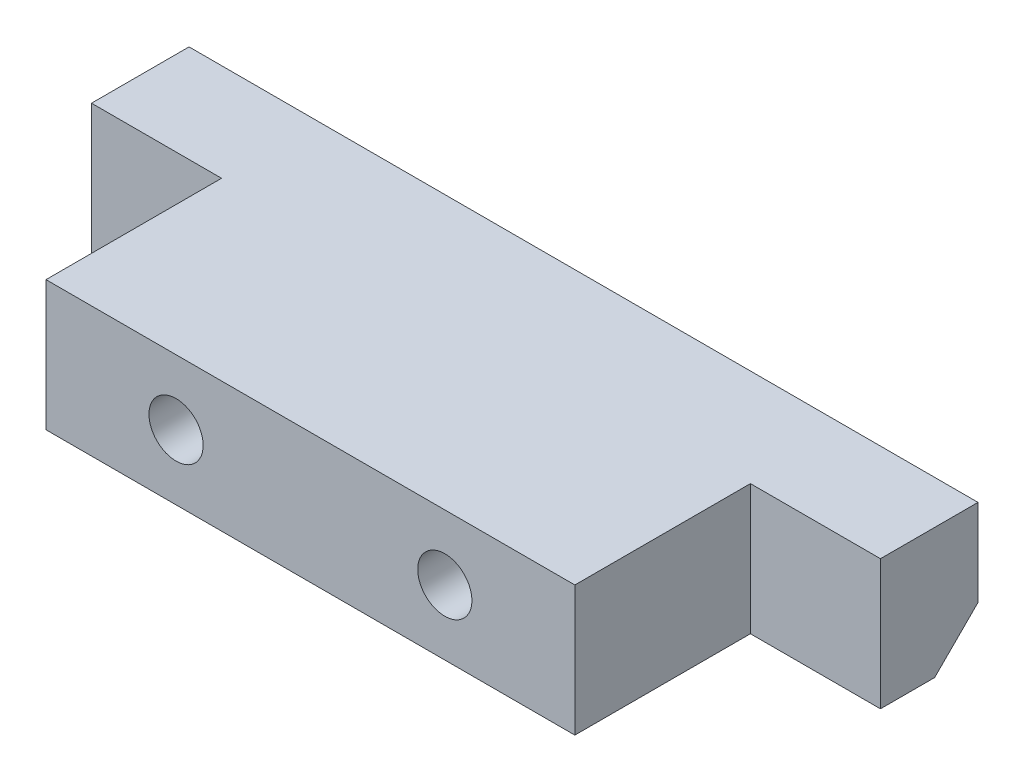
ISO-10303-21;
HEADER;
FILE_DESCRIPTION(('STEP AP214'),'2;1');
FILE_NAME('part.step','',(''),(''),'','','');
FILE_SCHEMA(('AUTOMOTIVE_DESIGN { 1 0 10303 214 1 1 1 1 }'));
ENDSEC;
DATA;
#1=APPLICATION_CONTEXT('core data for automotive mechanical design processes');
#2=APPLICATION_PROTOCOL_DEFINITION('international standard','automotive_design',2000,#1);
#3=PRODUCT_CONTEXT('',#1,'mechanical');
#4=PRODUCT('Part','Part','',(#3));
#5=PRODUCT_RELATED_PRODUCT_CATEGORY('part','',(#4));
#6=PRODUCT_DEFINITION_FORMATION('','',#4);
#7=PRODUCT_DEFINITION_CONTEXT('part definition',#1,'design');
#8=PRODUCT_DEFINITION('design','',#6,#7);
#9=PRODUCT_DEFINITION_SHAPE('','',#8);
#10=(LENGTH_UNIT() NAMED_UNIT(*) SI_UNIT(.MILLI.,.METRE.));
#11=(NAMED_UNIT(*) PLANE_ANGLE_UNIT() SI_UNIT($,.RADIAN.));
#12=(NAMED_UNIT(*) SI_UNIT($,.STERADIAN.) SOLID_ANGLE_UNIT());
#13=UNCERTAINTY_MEASURE_WITH_UNIT(LENGTH_MEASURE(1.E-05),#10,'distance_accuracy_value','');
#14=(GEOMETRIC_REPRESENTATION_CONTEXT(3) GLOBAL_UNCERTAINTY_ASSIGNED_CONTEXT((#13)) GLOBAL_UNIT_ASSIGNED_CONTEXT((#10,
#11,#12)) REPRESENTATION_CONTEXT('',''));
#15=CARTESIAN_POINT('',(0.,0.,0.));
#16=DIRECTION('',(0.,0.,1.));
#17=DIRECTION('',(1.,0.,0.));
#18=AXIS2_PLACEMENT_3D('',#15,#16,#17);
#19=CARTESIAN_POINT('',(-12.2,0.,8.1));
#20=DIRECTION('',(1.,0.,0.));
#21=DIRECTION('',(0.,0.,-1.));
#22=AXIS2_PLACEMENT_3D('',#19,#20,#21);
#23=PLANE('',#22);
#24=DIRECTION('',(0.,-1.,0.));
#25=VECTOR('',#24,1.);
#26=CARTESIAN_POINT('',(-12.2,0.,0.));
#27=LINE('',#26,#25);
#28=CARTESIAN_POINT('',(-12.2,6.,0.));
#29=VERTEX_POINT('',#28);
#30=CARTESIAN_POINT('',(-12.2,0.,0.));
#31=VERTEX_POINT('',#30);
#32=EDGE_CURVE('E163',#29,#31,#27,.T.);
#33=ORIENTED_EDGE('',*,*,#32,.T.);
#34=DIRECTION('',(0.,0.,-1.));
#35=VECTOR('',#34,1.);
#36=CARTESIAN_POINT('',(-12.2,0.,8.1));
#37=LINE('',#36,#35);
#38=CARTESIAN_POINT('',(-12.2,0.,8.1));
#39=VERTEX_POINT('',#38);
#40=EDGE_CURVE('E196',#39,#31,#37,.T.);
#41=ORIENTED_EDGE('',*,*,#40,.F.);
#42=DIRECTION('',(0.,-1.,0.));
#43=VECTOR('',#42,1.);
#44=CARTESIAN_POINT('',(-12.2,0.,8.1));
#45=LINE('',#44,#43);
#46=CARTESIAN_POINT('',(-12.2,6.,8.1));
#47=VERTEX_POINT('',#46);
#48=EDGE_CURVE('E172',#47,#39,#45,.T.);
#49=ORIENTED_EDGE('',*,*,#48,.F.);
#50=DIRECTION('',(0.,0.,-1.));
#51=VECTOR('',#50,1.);
#52=CARTESIAN_POINT('',(-12.2,6.,8.1));
#53=LINE('',#52,#51);
#54=EDGE_CURVE('E179',#47,#29,#53,.T.);
#55=ORIENTED_EDGE('',*,*,#54,.T.);
#56=EDGE_LOOP('',(#33,#41,#49,#55));
#57=FACE_BOUND('',#56,.T.);
#58=ADVANCED_FACE('F32',(#57),#23,.F.);
#59=CARTESIAN_POINT('',(-12.2,0.,8.1));
#60=DIRECTION('',(0.,1.,0.));
#61=DIRECTION('',(-1.,0.,0.));
#62=AXIS2_PLACEMENT_3D('',#59,#60,#61);
#63=PLANE('',#62);
#64=DIRECTION('',(0.,0.,1.));
#65=VECTOR('',#64,1.);
#66=CARTESIAN_POINT('',(-18.2,0.,-4.5));
#67=LINE('',#66,#65);
#68=CARTESIAN_POINT('',(-18.2,0.,-2.49999999999999));
#69=VERTEX_POINT('',#68);
#70=CARTESIAN_POINT('',(-18.2,0.,0.));
#71=VERTEX_POINT('',#70);
#72=EDGE_CURVE('E161',#69,#71,#67,.T.);
#73=ORIENTED_EDGE('',*,*,#72,.F.);
#74=DIRECTION('',(1.,0.,0.));
#75=VECTOR('',#74,1.);
#76=CARTESIAN_POINT('',(-12.2,0.,-2.49999999999999));
#77=LINE('',#76,#75);
#78=CARTESIAN_POINT('',(18.2,0.,-2.49999999999999));
#79=VERTEX_POINT('',#78);
#80=EDGE_CURVE('E40',#69,#79,#77,.T.);
#81=ORIENTED_EDGE('',*,*,#80,.T.);
#82=DIRECTION('',(0.,0.,1.));
#83=VECTOR('',#82,1.);
#84=CARTESIAN_POINT('',(18.2,0.,-4.5));
#85=LINE('',#84,#83);
#86=CARTESIAN_POINT('',(18.2,0.,0.));
#87=VERTEX_POINT('',#86);
#88=EDGE_CURVE('E162',#79,#87,#85,.T.);
#89=ORIENTED_EDGE('',*,*,#88,.T.);
#90=DIRECTION('',(-1.,0.,0.));
#91=VECTOR('',#90,1.);
#92=CARTESIAN_POINT('',(18.2,0.,0.));
#93=LINE('',#92,#91);
#94=CARTESIAN_POINT('',(12.2,0.,0.));
#95=VERTEX_POINT('',#94);
#96=EDGE_CURVE('E147',#87,#95,#93,.T.);
#97=ORIENTED_EDGE('',*,*,#96,.T.);
#98=DIRECTION('',(0.,0.,-1.));
#99=VECTOR('',#98,1.);
#100=CARTESIAN_POINT('',(12.2,0.,8.1));
#101=LINE('',#100,#99);
#102=CARTESIAN_POINT('',(12.2,0.,8.1));
#103=VERTEX_POINT('',#102);
#104=EDGE_CURVE('E191',#103,#95,#101,.T.);
#105=ORIENTED_EDGE('',*,*,#104,.F.);
#106=DIRECTION('',(1.,0.,0.));
#107=VECTOR('',#106,1.);
#108=CARTESIAN_POINT('',(-12.2,0.,8.1));
#109=LINE('',#108,#107);
#110=EDGE_CURVE('E271',#39,#103,#109,.T.);
#111=ORIENTED_EDGE('',*,*,#110,.F.);
#112=ORIENTED_EDGE('',*,*,#40,.T.);
#113=EDGE_CURVE('E138',#31,#71,#93,.T.);
#114=ORIENTED_EDGE('',*,*,#113,.T.);
#115=EDGE_LOOP('',(#73,#81,#89,#97,#105,#111,#112,#114));
#116=FACE_BOUND('',#115,.T.);
#117=ADVANCED_FACE('F233',(#116),#63,.F.);
#118=CARTESIAN_POINT('',(12.2,0.,8.1));
#119=DIRECTION('',(-1.,0.,0.));
#120=DIRECTION('',(0.,-1.,0.));
#121=AXIS2_PLACEMENT_3D('',#118,#119,#120);
#122=PLANE('',#121);
#123=DIRECTION('',(0.,1.,0.));
#124=VECTOR('',#123,1.);
#125=CARTESIAN_POINT('',(12.2,0.,0.));
#126=LINE('',#125,#124);
#127=CARTESIAN_POINT('',(12.2,6.,0.));
#128=VERTEX_POINT('',#127);
#129=EDGE_CURVE('E166',#95,#128,#126,.T.);
#130=ORIENTED_EDGE('',*,*,#129,.T.);
#131=DIRECTION('',(0.,0.,-1.));
#132=VECTOR('',#131,1.);
#133=CARTESIAN_POINT('',(12.2,6.,8.1));
#134=LINE('',#133,#132);
#135=CARTESIAN_POINT('',(12.2,6.,8.1));
#136=VERTEX_POINT('',#135);
#137=EDGE_CURVE('E188',#136,#128,#134,.T.);
#138=ORIENTED_EDGE('',*,*,#137,.F.);
#139=DIRECTION('',(0.,1.,0.));
#140=VECTOR('',#139,1.);
#141=CARTESIAN_POINT('',(12.2,0.,8.1));
#142=LINE('',#141,#140);
#143=EDGE_CURVE('E275',#103,#136,#142,.T.);
#144=ORIENTED_EDGE('',*,*,#143,.F.);
#145=ORIENTED_EDGE('',*,*,#104,.T.);
#146=EDGE_LOOP('',(#130,#138,#144,#145));
#147=FACE_BOUND('',#146,.T.);
#148=ADVANCED_FACE('F237',(#147),#122,.F.);
#149=CARTESIAN_POINT('',(-12.2,6.,8.1));
#150=DIRECTION('',(0.,-1.,0.));
#151=DIRECTION('',(1.,0.,0.));
#152=AXIS2_PLACEMENT_3D('',#149,#150,#151);
#153=PLANE('',#152);
#154=ORIENTED_EDGE('',*,*,#137,.T.);
#155=DIRECTION('',(1.,0.,0.));
#156=VECTOR('',#155,1.);
#157=CARTESIAN_POINT('',(18.2,6.,0.));
#158=LINE('',#157,#156);
#159=CARTESIAN_POINT('',(18.2,6.,0.));
#160=VERTEX_POINT('',#159);
#161=EDGE_CURVE('E150',#128,#160,#158,.T.);
#162=ORIENTED_EDGE('',*,*,#161,.T.);
#163=DIRECTION('',(0.,0.,1.));
#164=VECTOR('',#163,1.);
#165=CARTESIAN_POINT('',(18.2,6.,-4.5));
#166=LINE('',#165,#164);
#167=CARTESIAN_POINT('',(18.2,6.,-4.5));
#168=VERTEX_POINT('',#167);
#169=EDGE_CURVE('E135',#168,#160,#166,.T.);
#170=ORIENTED_EDGE('',*,*,#169,.F.);
#171=DIRECTION('',(1.,0.,0.));
#172=VECTOR('',#171,1.);
#173=CARTESIAN_POINT('',(18.2,6.,-4.5));
#174=LINE('',#173,#172);
#175=CARTESIAN_POINT('',(-18.2,6.,-4.5));
#176=VERTEX_POINT('',#175);
#177=EDGE_CURVE('E133',#176,#168,#174,.T.);
#178=ORIENTED_EDGE('',*,*,#177,.F.);
#179=DIRECTION('',(0.,0.,1.));
#180=VECTOR('',#179,1.);
#181=CARTESIAN_POINT('',(-18.2,6.,-4.5));
#182=LINE('',#181,#180);
#183=CARTESIAN_POINT('',(-18.2,6.,0.));
#184=VERTEX_POINT('',#183);
#185=EDGE_CURVE('E158',#176,#184,#182,.T.);
#186=ORIENTED_EDGE('',*,*,#185,.T.);
#187=EDGE_CURVE('E131',#184,#29,#158,.T.);
#188=ORIENTED_EDGE('',*,*,#187,.T.);
#189=ORIENTED_EDGE('',*,*,#54,.F.);
#190=DIRECTION('',(-1.,0.,0.));
#191=VECTOR('',#190,1.);
#192=CARTESIAN_POINT('',(-12.2,6.,8.1));
#193=LINE('',#192,#191);
#194=EDGE_CURVE('E184',#136,#47,#193,.T.);
#195=ORIENTED_EDGE('',*,*,#194,.F.);
#196=EDGE_LOOP('',(#154,#162,#170,#178,#186,#188,#189,#195));
#197=FACE_BOUND('',#196,.T.);
#198=ADVANCED_FACE('F219',(#197),#153,.F.);
#199=CARTESIAN_POINT('',(0.,0.,8.1));
#200=DIRECTION('',(0.,0.,-1.));
#201=DIRECTION('',(-1.,0.,0.));
#202=AXIS2_PLACEMENT_3D('',#199,#200,#201);
#203=PLANE('',#202);
#204=CARTESIAN_POINT('',(-6.2,3.,8.1));
#205=DIRECTION('',(0.,0.,1.));
#206=DIRECTION('',(1.,0.,0.));
#207=AXIS2_PLACEMENT_3D('',#204,#205,#206);
#208=CIRCLE('',#207,1.24999999999999);
#209=CARTESIAN_POINT('',(-4.95000000000001,3.,8.1));
#210=VERTEX_POINT('',#209);
#211=EDGE_CURVE('E116',#210,#210,#208,.T.);
#212=ORIENTED_EDGE('',*,*,#211,.F.);
#213=EDGE_LOOP('',(#212));
#214=FACE_BOUND('',#213,.T.);
#215=CARTESIAN_POINT('',(6.2,3.,8.1));
#216=DIRECTION('',(0.,0.,1.));
#217=DIRECTION('',(1.,0.,0.));
#218=AXIS2_PLACEMENT_3D('',#215,#216,#217);
#219=CIRCLE('',#218,1.24999999999999);
#220=CARTESIAN_POINT('',(7.44999999999999,3.,8.1));
#221=VERTEX_POINT('',#220);
#222=EDGE_CURVE('E115',#221,#221,#219,.T.);
#223=ORIENTED_EDGE('',*,*,#222,.F.);
#224=EDGE_LOOP('',(#223));
#225=FACE_BOUND('',#224,.T.);
#226=ORIENTED_EDGE('',*,*,#48,.T.);
#227=ORIENTED_EDGE('',*,*,#110,.T.);
#228=ORIENTED_EDGE('',*,*,#143,.T.);
#229=ORIENTED_EDGE('',*,*,#194,.T.);
#230=EDGE_LOOP('',(#226,#227,#228,#229));
#231=FACE_BOUND('',#230,.T.);
#232=ADVANCED_FACE('F245',(#214,#225,#231),#203,.F.);
#233=CARTESIAN_POINT('',(0.,0.,0.));
#234=DIRECTION('',(0.,0.,1.));
#235=DIRECTION('',(1.,0.,0.));
#236=AXIS2_PLACEMENT_3D('',#233,#234,#235);
#237=PLANE('',#236);
#238=ORIENTED_EDGE('',*,*,#32,.F.);
#239=ORIENTED_EDGE('',*,*,#187,.F.);
#240=DIRECTION('',(0.,1.,0.));
#241=VECTOR('',#240,1.);
#242=CARTESIAN_POINT('',(-18.2,0.,0.));
#243=LINE('',#242,#241);
#244=EDGE_CURVE('E141',#71,#184,#243,.T.);
#245=ORIENTED_EDGE('',*,*,#244,.F.);
#246=ORIENTED_EDGE('',*,*,#113,.F.);
#247=EDGE_LOOP('',(#238,#239,#245,#246));
#248=FACE_BOUND('',#247,.T.);
#249=ADVANCED_FACE('F248',(#248),#237,.T.);
#250=ORIENTED_EDGE('',*,*,#129,.F.);
#251=ORIENTED_EDGE('',*,*,#96,.F.);
#252=DIRECTION('',(0.,-1.,0.));
#253=VECTOR('',#252,1.);
#254=CARTESIAN_POINT('',(18.2,0.,0.));
#255=LINE('',#254,#253);
#256=EDGE_CURVE('E126',#160,#87,#255,.T.);
#257=ORIENTED_EDGE('',*,*,#256,.F.);
#258=ORIENTED_EDGE('',*,*,#161,.F.);
#259=EDGE_LOOP('',(#250,#251,#257,#258));
#260=FACE_BOUND('',#259,.T.);
#261=ADVANCED_FACE('F252',(#260),#237,.T.);
#262=CARTESIAN_POINT('',(18.2,0.,-4.5));
#263=DIRECTION('',(-1.,0.,0.));
#264=DIRECTION('',(0.,0.,1.));
#265=AXIS2_PLACEMENT_3D('',#262,#263,#264);
#266=PLANE('',#265);
#267=ORIENTED_EDGE('',*,*,#88,.F.);
#268=DIRECTION('',(0.,-0.707106781186548,0.707106781186547));
#269=VECTOR('',#268,1.);
#270=CARTESIAN_POINT('',(18.2,2.00000000000001,-4.5));
#271=LINE('',#270,#269);
#272=CARTESIAN_POINT('',(18.2,2.00000000000001,-4.5));
#273=VERTEX_POINT('',#272);
#274=EDGE_CURVE('E11',#79,#273,#271,.F.);
#275=ORIENTED_EDGE('',*,*,#274,.T.);
#276=DIRECTION('',(0.,-1.,0.));
#277=VECTOR('',#276,1.);
#278=CARTESIAN_POINT('',(18.2,0.,-4.5));
#279=LINE('',#278,#277);
#280=EDGE_CURVE('E127',#168,#273,#279,.T.);
#281=ORIENTED_EDGE('',*,*,#280,.F.);
#282=ORIENTED_EDGE('',*,*,#169,.T.);
#283=ORIENTED_EDGE('',*,*,#256,.T.);
#284=EDGE_LOOP('',(#267,#275,#281,#282,#283));
#285=FACE_BOUND('',#284,.T.);
#286=ADVANCED_FACE('F222',(#285),#266,.F.);
#287=CARTESIAN_POINT('',(-18.2,0.,-4.5));
#288=DIRECTION('',(1.,0.,0.));
#289=DIRECTION('',(0.,0.,-1.));
#290=AXIS2_PLACEMENT_3D('',#287,#288,#289);
#291=PLANE('',#290);
#292=DIRECTION('',(0.,1.,0.));
#293=VECTOR('',#292,1.);
#294=CARTESIAN_POINT('',(-18.2,0.,-4.5));
#295=LINE('',#294,#293);
#296=CARTESIAN_POINT('',(-18.2,2.00000000000001,-4.5));
#297=VERTEX_POINT('',#296);
#298=EDGE_CURVE('E130',#297,#176,#295,.T.);
#299=ORIENTED_EDGE('',*,*,#298,.F.);
#300=DIRECTION('',(0.,0.707106781186548,-0.707106781186547));
#301=VECTOR('',#300,1.);
#302=CARTESIAN_POINT('',(-18.2,2.00000000000001,-4.5));
#303=LINE('',#302,#301);
#304=EDGE_CURVE('E54',#297,#69,#303,.F.);
#305=ORIENTED_EDGE('',*,*,#304,.T.);
#306=ORIENTED_EDGE('',*,*,#72,.T.);
#307=ORIENTED_EDGE('',*,*,#244,.T.);
#308=ORIENTED_EDGE('',*,*,#185,.F.);
#309=EDGE_LOOP('',(#299,#305,#306,#307,#308));
#310=FACE_BOUND('',#309,.T.);
#311=ADVANCED_FACE('F212',(#310),#291,.F.);
#312=CARTESIAN_POINT('',(0.,0.,-4.5));
#313=DIRECTION('',(0.,0.,1.));
#314=DIRECTION('',(1.,0.,0.));
#315=AXIS2_PLACEMENT_3D('',#312,#313,#314);
#316=PLANE('',#315);
#317=ORIENTED_EDGE('',*,*,#280,.T.);
#318=DIRECTION('',(-1.,0.,0.));
#319=VECTOR('',#318,1.);
#320=CARTESIAN_POINT('',(0.,2.00000000000001,-4.5));
#321=LINE('',#320,#319);
#322=EDGE_CURVE('E199',#273,#297,#321,.T.);
#323=ORIENTED_EDGE('',*,*,#322,.T.);
#324=ORIENTED_EDGE('',*,*,#298,.T.);
#325=ORIENTED_EDGE('',*,*,#177,.T.);
#326=EDGE_LOOP('',(#317,#323,#324,#325));
#327=FACE_BOUND('',#326,.T.);
#328=ADVANCED_FACE('F207',(#327),#316,.F.);
#329=CARTESIAN_POINT('',(0.,2.00000000000001,-4.5));
#330=DIRECTION('',(0.,0.707106781186547,0.707106781186548));
#331=DIRECTION('',(-1.,0.,0.));
#332=AXIS2_PLACEMENT_3D('',#329,#330,#331);
#333=PLANE('',#332);
#334=ORIENTED_EDGE('',*,*,#274,.F.);
#335=ORIENTED_EDGE('',*,*,#80,.F.);
#336=ORIENTED_EDGE('',*,*,#304,.F.);
#337=ORIENTED_EDGE('',*,*,#322,.F.);
#338=EDGE_LOOP('',(#334,#335,#336,#337));
#339=FACE_BOUND('',#338,.T.);
#340=ADVANCED_FACE('F34',(#339),#333,.F.);
#341=CARTESIAN_POINT('',(6.2,3.,-0.399999999999994));
#342=DIRECTION('',(0.,0.,1.));
#343=DIRECTION('',(1.,0.,0.));
#344=AXIS2_PLACEMENT_3D('',#341,#342,#343);
#345=CONICAL_SURFACE('',#344,1.24999999999999,1.02974425867665);
#346=CARTESIAN_POINT('',(6.2,3.,-1.15107577378444));
#347=VERTEX_POINT('',#346);
#348=VERTEX_LOOP('',#347);
#349=FACE_BOUND('',#348,.T.);
#350=CARTESIAN_POINT('',(6.2,3.,-0.399999999999994));
#351=DIRECTION('',(0.,0.,1.));
#352=DIRECTION('',(1.,0.,0.));
#353=AXIS2_PLACEMENT_3D('',#350,#351,#352);
#354=CIRCLE('',#353,1.24999999999999);
#355=CARTESIAN_POINT('',(7.44999999999999,3.,-0.399999999999994));
#356=VERTEX_POINT('',#355);
#357=EDGE_CURVE('E119',#356,#356,#354,.T.);
#358=ORIENTED_EDGE('',*,*,#357,.T.);
#359=EDGE_LOOP('',(#358));
#360=FACE_BOUND('',#359,.T.);
#361=ADVANCED_FACE('F224',(#349,#360),#345,.F.);
#362=CARTESIAN_POINT('',(6.2,3.,8.1));
#363=DIRECTION('',(0.,0.,1.));
#364=DIRECTION('',(1.,0.,0.));
#365=AXIS2_PLACEMENT_3D('',#362,#363,#364);
#366=CYLINDRICAL_SURFACE('',#365,1.24999999999999);
#367=ORIENTED_EDGE('',*,*,#357,.F.);
#368=EDGE_LOOP('',(#367));
#369=FACE_BOUND('',#368,.T.);
#370=ORIENTED_EDGE('',*,*,#222,.T.);
#371=EDGE_LOOP('',(#370));
#372=FACE_BOUND('',#371,.T.);
#373=ADVANCED_FACE('F109',(#369,#372),#366,.F.);
#374=CARTESIAN_POINT('',(-6.2,3.,-0.399999999999994));
#375=DIRECTION('',(0.,0.,1.));
#376=DIRECTION('',(1.,0.,0.));
#377=AXIS2_PLACEMENT_3D('',#374,#375,#376);
#378=CONICAL_SURFACE('',#377,1.24999999999999,1.02974425867665);
#379=CARTESIAN_POINT('',(-6.2,3.,-1.15107577378444));
#380=VERTEX_POINT('',#379);
#381=VERTEX_LOOP('',#380);
#382=FACE_BOUND('',#381,.T.);
#383=CARTESIAN_POINT('',(-6.2,3.,-0.399999999999994));
#384=DIRECTION('',(0.,0.,1.));
#385=DIRECTION('',(1.,0.,0.));
#386=AXIS2_PLACEMENT_3D('',#383,#384,#385);
#387=CIRCLE('',#386,1.24999999999999);
#388=CARTESIAN_POINT('',(-4.95000000000001,3.,-0.399999999999994));
#389=VERTEX_POINT('',#388);
#390=EDGE_CURVE('E113',#389,#389,#387,.T.);
#391=ORIENTED_EDGE('',*,*,#390,.T.);
#392=EDGE_LOOP('',(#391));
#393=FACE_BOUND('',#392,.T.);
#394=ADVANCED_FACE('F105',(#382,#393),#378,.F.);
#395=CARTESIAN_POINT('',(-6.2,3.,8.1));
#396=DIRECTION('',(0.,0.,1.));
#397=DIRECTION('',(1.,0.,0.));
#398=AXIS2_PLACEMENT_3D('',#395,#396,#397);
#399=CYLINDRICAL_SURFACE('',#398,1.24999999999999);
#400=ORIENTED_EDGE('',*,*,#390,.F.);
#401=EDGE_LOOP('',(#400));
#402=FACE_BOUND('',#401,.T.);
#403=ORIENTED_EDGE('',*,*,#211,.T.);
#404=EDGE_LOOP('',(#403));
#405=FACE_BOUND('',#404,.T.);
#406=ADVANCED_FACE('F108',(#402,#405),#399,.F.);
#407=CLOSED_SHELL('',(#58,#117,#148,#198,#232,#249,#261,#286,#311,#328,#340,#361,#373,#394,#406));
#408=MANIFOLD_SOLID_BREP('B2',#407);
#409=ADVANCED_BREP_SHAPE_REPRESENTATION('',(#18,#408),#14);
#410=SHAPE_DEFINITION_REPRESENTATION(#9,#409);
ENDSEC;
END-ISO-10303-21;
